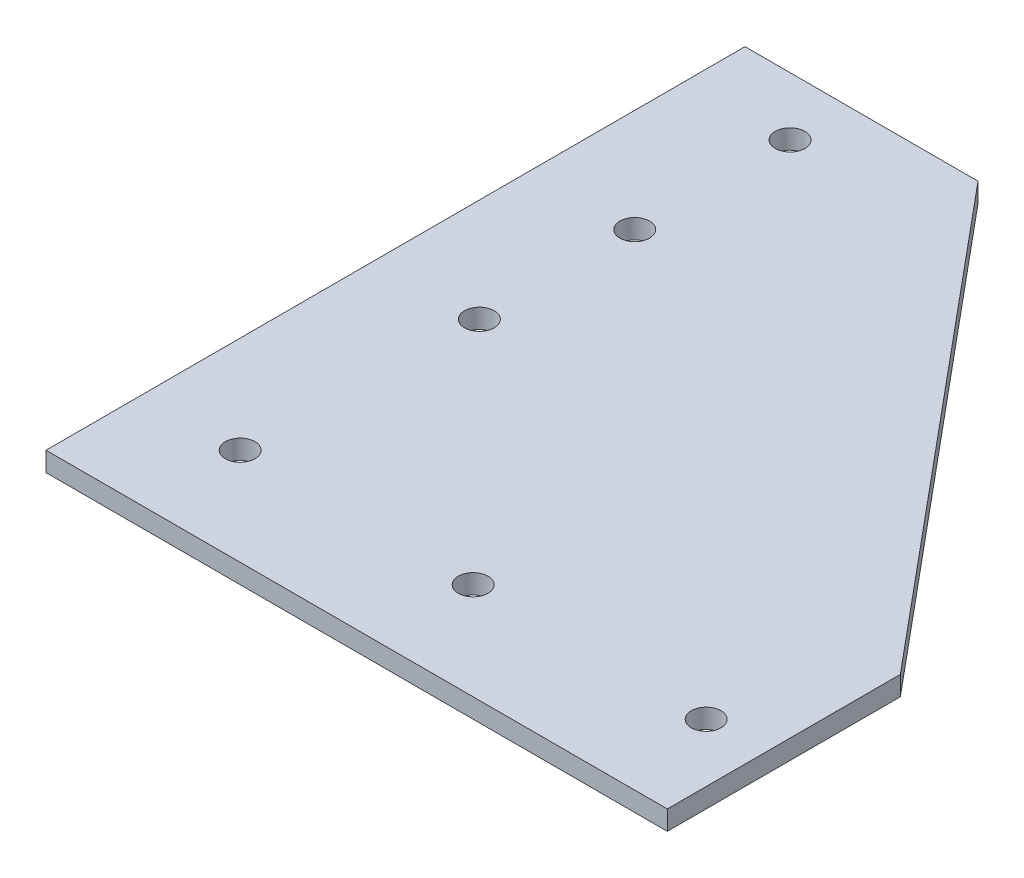
ISO-10303-21;
HEADER;
FILE_DESCRIPTION(('STEP AP214'),'2;1');
FILE_NAME('part.step','',(''),(''),'','','');
FILE_SCHEMA(('AUTOMOTIVE_DESIGN { 1 0 10303 214 1 1 1 1 }'));
ENDSEC;
DATA;
#1=APPLICATION_CONTEXT('core data for automotive mechanical design processes');
#2=APPLICATION_PROTOCOL_DEFINITION('international standard','automotive_design',2000,#1);
#3=PRODUCT_CONTEXT('',#1,'mechanical');
#4=PRODUCT('Part','Part','',(#3));
#5=PRODUCT_RELATED_PRODUCT_CATEGORY('part','',(#4));
#6=PRODUCT_DEFINITION_FORMATION('','',#4);
#7=PRODUCT_DEFINITION_CONTEXT('part definition',#1,'design');
#8=PRODUCT_DEFINITION('design','',#6,#7);
#9=PRODUCT_DEFINITION_SHAPE('','',#8);
#10=(LENGTH_UNIT() NAMED_UNIT(*) SI_UNIT(.MILLI.,.METRE.));
#11=(NAMED_UNIT(*) PLANE_ANGLE_UNIT() SI_UNIT($,.RADIAN.));
#12=(NAMED_UNIT(*) SI_UNIT($,.STERADIAN.) SOLID_ANGLE_UNIT());
#13=UNCERTAINTY_MEASURE_WITH_UNIT(LENGTH_MEASURE(1.E-05),#10,'distance_accuracy_value','');
#14=(GEOMETRIC_REPRESENTATION_CONTEXT(3) GLOBAL_UNCERTAINTY_ASSIGNED_CONTEXT((#13)) GLOBAL_UNIT_ASSIGNED_CONTEXT((#10,
#11,#12)) REPRESENTATION_CONTEXT('',''));
#15=CARTESIAN_POINT('',(0.,0.,0.));
#16=DIRECTION('',(0.,0.,1.));
#17=DIRECTION('',(1.,0.,0.));
#18=AXIS2_PLACEMENT_3D('',#15,#16,#17);
#19=CARTESIAN_POINT('',(0.,3.175,0.));
#20=DIRECTION('',(0.,-1.,0.));
#21=DIRECTION('',(0.,0.,-1.));
#22=AXIS2_PLACEMENT_3D('',#19,#20,#21);
#23=PLANE('',#22);
#24=DIRECTION('',(1.,0.,0.));
#25=VECTOR('',#24,1.);
#26=CARTESIAN_POINT('',(101.6,3.175,0.));
#27=LINE('',#26,#25);
#28=CARTESIAN_POINT('',(0.,3.175,0.));
#29=VERTEX_POINT('',#28);
#30=CARTESIAN_POINT('',(101.6,3.175,0.));
#31=VERTEX_POINT('',#30);
#32=EDGE_CURVE('E117',#29,#31,#27,.T.);
#33=ORIENTED_EDGE('',*,*,#32,.T.);
#34=DIRECTION('',(0.,0.,-1.));
#35=VECTOR('',#34,1.);
#36=CARTESIAN_POINT('',(101.6,3.175,-38.1));
#37=LINE('',#36,#35);
#38=CARTESIAN_POINT('',(101.6,3.175,-38.1));
#39=VERTEX_POINT('',#38);
#40=EDGE_CURVE('E84',#31,#39,#37,.T.);
#41=ORIENTED_EDGE('',*,*,#40,.T.);
#42=DIRECTION('',(-0.64018439966448,0.,-0.768221279597376));
#43=VECTOR('',#42,1.);
#44=CARTESIAN_POINT('',(38.1,3.175,-114.3));
#45=LINE('',#44,#43);
#46=CARTESIAN_POINT('',(38.1,3.175,-114.3));
#47=VERTEX_POINT('',#46);
#48=EDGE_CURVE('E88',#39,#47,#45,.T.);
#49=ORIENTED_EDGE('',*,*,#48,.T.);
#50=DIRECTION('',(-1.,0.,0.));
#51=VECTOR('',#50,1.);
#52=CARTESIAN_POINT('',(0.,3.175,-114.3));
#53=LINE('',#52,#51);
#54=CARTESIAN_POINT('',(0.,3.175,-114.3));
#55=VERTEX_POINT('',#54);
#56=EDGE_CURVE('E92',#47,#55,#53,.T.);
#57=ORIENTED_EDGE('',*,*,#56,.T.);
#58=DIRECTION('',(0.,0.,1.));
#59=VECTOR('',#58,1.);
#60=CARTESIAN_POINT('',(0.,3.175,0.));
#61=LINE('',#60,#59);
#62=EDGE_CURVE('E50',#55,#29,#61,.T.);
#63=ORIENTED_EDGE('',*,*,#62,.T.);
#64=EDGE_LOOP('',(#33,#41,#49,#57,#63));
#65=FACE_BOUND('',#64,.T.);
#66=CARTESIAN_POINT('',(15.875,3.175,-15.875));
#67=DIRECTION('',(0.,1.,0.));
#68=DIRECTION('',(0.,0.,1.));
#69=AXIS2_PLACEMENT_3D('',#66,#67,#68);
#70=CIRCLE('',#69,2.4257);
#71=CARTESIAN_POINT('',(15.875,3.175,-13.4493));
#72=VERTEX_POINT('',#71);
#73=EDGE_CURVE('E112',#72,#72,#70,.T.);
#74=ORIENTED_EDGE('',*,*,#73,.F.);
#75=EDGE_LOOP('',(#74));
#76=FACE_BOUND('',#75,.T.);
#77=CARTESIAN_POINT('',(53.975,3.175,-15.875));
#78=DIRECTION('',(0.,1.,0.));
#79=DIRECTION('',(0.,0.,1.));
#80=AXIS2_PLACEMENT_3D('',#77,#78,#79);
#81=CIRCLE('',#80,2.4257);
#82=CARTESIAN_POINT('',(53.975,3.175,-13.4493));
#83=VERTEX_POINT('',#82);
#84=EDGE_CURVE('E196',#83,#83,#81,.T.);
#85=ORIENTED_EDGE('',*,*,#84,.F.);
#86=EDGE_LOOP('',(#85));
#87=FACE_BOUND('',#86,.T.);
#88=CARTESIAN_POINT('',(92.075,3.175,-15.875));
#89=DIRECTION('',(0.,1.,0.));
#90=DIRECTION('',(0.,0.,1.));
#91=AXIS2_PLACEMENT_3D('',#88,#89,#90);
#92=CIRCLE('',#91,2.4257);
#93=CARTESIAN_POINT('',(92.075,3.175,-13.4493));
#94=VERTEX_POINT('',#93);
#95=EDGE_CURVE('E190',#94,#94,#92,.T.);
#96=ORIENTED_EDGE('',*,*,#95,.F.);
#97=EDGE_LOOP('',(#96));
#98=FACE_BOUND('',#97,.T.);
#99=CARTESIAN_POINT('',(16.891,3.175,-53.975));
#100=DIRECTION('',(0.,1.,0.));
#101=DIRECTION('',(0.,0.,1.));
#102=AXIS2_PLACEMENT_3D('',#99,#100,#101);
#103=CIRCLE('',#102,2.4257);
#104=CARTESIAN_POINT('',(16.891,3.175,-51.5493));
#105=VERTEX_POINT('',#104);
#106=EDGE_CURVE('E184',#105,#105,#103,.T.);
#107=ORIENTED_EDGE('',*,*,#106,.F.);
#108=EDGE_LOOP('',(#107));
#109=FACE_BOUND('',#108,.T.);
#110=CARTESIAN_POINT('',(16.8909999999999,3.175,-79.375));
#111=DIRECTION('',(0.,1.,0.));
#112=DIRECTION('',(0.,0.,1.));
#113=AXIS2_PLACEMENT_3D('',#110,#111,#112);
#114=CIRCLE('',#113,2.4257);
#115=CARTESIAN_POINT('',(16.8909999999999,3.175,-76.9493));
#116=VERTEX_POINT('',#115);
#117=EDGE_CURVE('E178',#116,#116,#114,.T.);
#118=ORIENTED_EDGE('',*,*,#117,.F.);
#119=EDGE_LOOP('',(#118));
#120=FACE_BOUND('',#119,.T.);
#121=CARTESIAN_POINT('',(16.8909999999998,3.175,-104.775));
#122=DIRECTION('',(0.,1.,0.));
#123=DIRECTION('',(0.,0.,1.));
#124=AXIS2_PLACEMENT_3D('',#121,#122,#123);
#125=CIRCLE('',#124,2.4257);
#126=CARTESIAN_POINT('',(16.8909999999998,3.175,-102.3493));
#127=VERTEX_POINT('',#126);
#128=EDGE_CURVE('E169',#127,#127,#125,.T.);
#129=ORIENTED_EDGE('',*,*,#128,.F.);
#130=EDGE_LOOP('',(#129));
#131=FACE_BOUND('',#130,.T.);
#132=ADVANCED_FACE('F33',(#65,#76,#87,#98,#109,#120,#131),#23,.F.);
#133=CARTESIAN_POINT('',(0.,0.,0.));
#134=DIRECTION('',(0.,-1.,0.));
#135=DIRECTION('',(0.,0.,-1.));
#136=AXIS2_PLACEMENT_3D('',#133,#134,#135);
#137=PLANE('',#136);
#138=CARTESIAN_POINT('',(16.8909999999999,0.,-79.375));
#139=DIRECTION('',(0.,1.,0.));
#140=DIRECTION('',(0.,0.,1.));
#141=AXIS2_PLACEMENT_3D('',#138,#139,#140);
#142=CIRCLE('',#141,2.4257);
#143=CARTESIAN_POINT('',(16.8909999999999,0.,-76.9493));
#144=VERTEX_POINT('',#143);
#145=EDGE_CURVE('E175',#144,#144,#142,.T.);
#146=ORIENTED_EDGE('',*,*,#145,.T.);
#147=EDGE_LOOP('',(#146));
#148=FACE_BOUND('',#147,.T.);
#149=CARTESIAN_POINT('',(92.075,0.,-15.875));
#150=DIRECTION('',(0.,1.,0.));
#151=DIRECTION('',(0.,0.,1.));
#152=AXIS2_PLACEMENT_3D('',#149,#150,#151);
#153=CIRCLE('',#152,2.4257);
#154=CARTESIAN_POINT('',(92.075,0.,-13.4493));
#155=VERTEX_POINT('',#154);
#156=EDGE_CURVE('E187',#155,#155,#153,.T.);
#157=ORIENTED_EDGE('',*,*,#156,.T.);
#158=EDGE_LOOP('',(#157));
#159=FACE_BOUND('',#158,.T.);
#160=CARTESIAN_POINT('',(15.875,0.,-15.875));
#161=DIRECTION('',(0.,1.,0.));
#162=DIRECTION('',(0.,0.,1.));
#163=AXIS2_PLACEMENT_3D('',#160,#161,#162);
#164=CIRCLE('',#163,2.4257);
#165=CARTESIAN_POINT('',(15.875,0.,-13.4493));
#166=VERTEX_POINT('',#165);
#167=EDGE_CURVE('E199',#166,#166,#164,.T.);
#168=ORIENTED_EDGE('',*,*,#167,.T.);
#169=EDGE_LOOP('',(#168));
#170=FACE_BOUND('',#169,.T.);
#171=DIRECTION('',(1.,0.,0.));
#172=VECTOR('',#171,1.);
#173=CARTESIAN_POINT('',(101.6,0.,0.));
#174=LINE('',#173,#172);
#175=CARTESIAN_POINT('',(0.,0.,0.));
#176=VERTEX_POINT('',#175);
#177=CARTESIAN_POINT('',(101.6,0.,0.));
#178=VERTEX_POINT('',#177);
#179=EDGE_CURVE('E108',#176,#178,#174,.T.);
#180=ORIENTED_EDGE('',*,*,#179,.F.);
#181=DIRECTION('',(0.,0.,1.));
#182=VECTOR('',#181,1.);
#183=CARTESIAN_POINT('',(0.,0.,0.));
#184=LINE('',#183,#182);
#185=CARTESIAN_POINT('',(0.,0.,-114.3));
#186=VERTEX_POINT('',#185);
#187=EDGE_CURVE('E76',#186,#176,#184,.T.);
#188=ORIENTED_EDGE('',*,*,#187,.F.);
#189=DIRECTION('',(-1.,0.,0.));
#190=VECTOR('',#189,1.);
#191=CARTESIAN_POINT('',(0.,0.,-114.3));
#192=LINE('',#191,#190);
#193=CARTESIAN_POINT('',(38.1,0.,-114.3));
#194=VERTEX_POINT('',#193);
#195=EDGE_CURVE('E70',#194,#186,#192,.T.);
#196=ORIENTED_EDGE('',*,*,#195,.F.);
#197=DIRECTION('',(-0.64018439966448,0.,-0.768221279597376));
#198=VECTOR('',#197,1.);
#199=CARTESIAN_POINT('',(38.1,0.,-114.3));
#200=LINE('',#199,#198);
#201=CARTESIAN_POINT('',(101.6,0.,-38.1));
#202=VERTEX_POINT('',#201);
#203=EDGE_CURVE('E99',#202,#194,#200,.T.);
#204=ORIENTED_EDGE('',*,*,#203,.F.);
#205=DIRECTION('',(0.,0.,-1.));
#206=VECTOR('',#205,1.);
#207=CARTESIAN_POINT('',(101.6,0.,-38.1));
#208=LINE('',#207,#206);
#209=EDGE_CURVE('E111',#178,#202,#208,.T.);
#210=ORIENTED_EDGE('',*,*,#209,.F.);
#211=EDGE_LOOP('',(#180,#188,#196,#204,#210));
#212=FACE_BOUND('',#211,.T.);
#213=CARTESIAN_POINT('',(53.975,0.,-15.875));
#214=DIRECTION('',(0.,1.,0.));
#215=DIRECTION('',(0.,0.,1.));
#216=AXIS2_PLACEMENT_3D('',#213,#214,#215);
#217=CIRCLE('',#216,2.4257);
#218=CARTESIAN_POINT('',(53.975,0.,-13.4493));
#219=VERTEX_POINT('',#218);
#220=EDGE_CURVE('E193',#219,#219,#217,.T.);
#221=ORIENTED_EDGE('',*,*,#220,.T.);
#222=EDGE_LOOP('',(#221));
#223=FACE_BOUND('',#222,.T.);
#224=CARTESIAN_POINT('',(16.891,0.,-53.975));
#225=DIRECTION('',(0.,1.,0.));
#226=DIRECTION('',(0.,0.,1.));
#227=AXIS2_PLACEMENT_3D('',#224,#225,#226);
#228=CIRCLE('',#227,2.4257);
#229=CARTESIAN_POINT('',(16.891,0.,-51.5493));
#230=VERTEX_POINT('',#229);
#231=EDGE_CURVE('E181',#230,#230,#228,.T.);
#232=ORIENTED_EDGE('',*,*,#231,.T.);
#233=EDGE_LOOP('',(#232));
#234=FACE_BOUND('',#233,.T.);
#235=CARTESIAN_POINT('',(16.8909999999998,0.,-104.775));
#236=DIRECTION('',(0.,1.,0.));
#237=DIRECTION('',(0.,0.,1.));
#238=AXIS2_PLACEMENT_3D('',#235,#236,#237);
#239=CIRCLE('',#238,2.4257);
#240=CARTESIAN_POINT('',(16.8909999999998,0.,-102.3493));
#241=VERTEX_POINT('',#240);
#242=EDGE_CURVE('E172',#241,#241,#239,.T.);
#243=ORIENTED_EDGE('',*,*,#242,.T.);
#244=EDGE_LOOP('',(#243));
#245=FACE_BOUND('',#244,.T.);
#246=ADVANCED_FACE('F121',(#148,#159,#170,#212,#223,#234,#245),#137,.T.);
#247=CARTESIAN_POINT('',(101.6,3.175,0.));
#248=DIRECTION('',(0.,0.,-1.));
#249=DIRECTION('',(-1.,0.,0.));
#250=AXIS2_PLACEMENT_3D('',#247,#248,#249);
#251=PLANE('',#250);
#252=ORIENTED_EDGE('',*,*,#179,.T.);
#253=DIRECTION('',(0.,-1.,0.));
#254=VECTOR('',#253,1.);
#255=CARTESIAN_POINT('',(101.6,3.175,0.));
#256=LINE('',#255,#254);
#257=EDGE_CURVE('E11',#31,#178,#256,.T.);
#258=ORIENTED_EDGE('',*,*,#257,.F.);
#259=ORIENTED_EDGE('',*,*,#32,.F.);
#260=DIRECTION('',(0.,-1.,0.));
#261=VECTOR('',#260,1.);
#262=CARTESIAN_POINT('',(0.,3.175,0.));
#263=LINE('',#262,#261);
#264=EDGE_CURVE('E104',#29,#176,#263,.T.);
#265=ORIENTED_EDGE('',*,*,#264,.T.);
#266=EDGE_LOOP('',(#252,#258,#259,#265));
#267=FACE_BOUND('',#266,.T.);
#268=ADVANCED_FACE('F35',(#267),#251,.F.);
#269=CARTESIAN_POINT('',(101.6,3.175,-38.1));
#270=DIRECTION('',(-1.,0.,0.));
#271=DIRECTION('',(0.,0.,1.));
#272=AXIS2_PLACEMENT_3D('',#269,#270,#271);
#273=PLANE('',#272);
#274=ORIENTED_EDGE('',*,*,#209,.T.);
#275=DIRECTION('',(0.,-1.,0.));
#276=VECTOR('',#275,1.);
#277=CARTESIAN_POINT('',(101.6,3.175,-38.1));
#278=LINE('',#277,#276);
#279=EDGE_CURVE('E42',#39,#202,#278,.T.);
#280=ORIENTED_EDGE('',*,*,#279,.F.);
#281=ORIENTED_EDGE('',*,*,#40,.F.);
#282=ORIENTED_EDGE('',*,*,#257,.T.);
#283=EDGE_LOOP('',(#274,#280,#281,#282));
#284=FACE_BOUND('',#283,.T.);
#285=ADVANCED_FACE('F268',(#284),#273,.F.);
#286=CARTESIAN_POINT('',(38.1,3.175,-114.3));
#287=DIRECTION('',(-0.768221279597376,0.,0.64018439966448));
#288=DIRECTION('',(0.64018439966448,0.,0.768221279597376));
#289=AXIS2_PLACEMENT_3D('',#286,#287,#288);
#290=PLANE('',#289);
#291=ORIENTED_EDGE('',*,*,#203,.T.);
#292=DIRECTION('',(0.,-1.,0.));
#293=VECTOR('',#292,1.);
#294=CARTESIAN_POINT('',(38.1,3.175,-114.3));
#295=LINE('',#294,#293);
#296=EDGE_CURVE('E96',#47,#194,#295,.T.);
#297=ORIENTED_EDGE('',*,*,#296,.F.);
#298=ORIENTED_EDGE('',*,*,#48,.F.);
#299=ORIENTED_EDGE('',*,*,#279,.T.);
#300=EDGE_LOOP('',(#291,#297,#298,#299));
#301=FACE_BOUND('',#300,.T.);
#302=ADVANCED_FACE('F97',(#301),#290,.F.);
#303=CARTESIAN_POINT('',(0.,3.175,-114.3));
#304=DIRECTION('',(0.,0.,1.));
#305=DIRECTION('',(1.,0.,0.));
#306=AXIS2_PLACEMENT_3D('',#303,#304,#305);
#307=PLANE('',#306);
#308=ORIENTED_EDGE('',*,*,#195,.T.);
#309=DIRECTION('',(0.,-1.,0.));
#310=VECTOR('',#309,1.);
#311=CARTESIAN_POINT('',(0.,3.175,-114.3));
#312=LINE('',#311,#310);
#313=EDGE_CURVE('E100',#55,#186,#312,.T.);
#314=ORIENTED_EDGE('',*,*,#313,.F.);
#315=ORIENTED_EDGE('',*,*,#56,.F.);
#316=ORIENTED_EDGE('',*,*,#296,.T.);
#317=EDGE_LOOP('',(#308,#314,#315,#316));
#318=FACE_BOUND('',#317,.T.);
#319=ADVANCED_FACE('F102',(#318),#307,.F.);
#320=CARTESIAN_POINT('',(0.,3.175,0.));
#321=DIRECTION('',(1.,0.,0.));
#322=DIRECTION('',(0.,0.,-1.));
#323=AXIS2_PLACEMENT_3D('',#320,#321,#322);
#324=PLANE('',#323);
#325=ORIENTED_EDGE('',*,*,#187,.T.);
#326=ORIENTED_EDGE('',*,*,#264,.F.);
#327=ORIENTED_EDGE('',*,*,#62,.F.);
#328=ORIENTED_EDGE('',*,*,#313,.T.);
#329=EDGE_LOOP('',(#325,#326,#327,#328));
#330=FACE_BOUND('',#329,.T.);
#331=ADVANCED_FACE('F126',(#330),#324,.F.);
#332=CARTESIAN_POINT('',(15.875,3.175,-15.875));
#333=DIRECTION('',(0.,-1.,0.));
#334=DIRECTION('',(0.,0.,-1.));
#335=AXIS2_PLACEMENT_3D('',#332,#333,#334);
#336=CYLINDRICAL_SURFACE('',#335,2.4257);
#337=ORIENTED_EDGE('',*,*,#73,.T.);
#338=EDGE_LOOP('',(#337));
#339=FACE_BOUND('',#338,.T.);
#340=ORIENTED_EDGE('',*,*,#167,.F.);
#341=EDGE_LOOP('',(#340));
#342=FACE_BOUND('',#341,.T.);
#343=ADVANCED_FACE('F128',(#339,#342),#336,.F.);
#344=CARTESIAN_POINT('',(53.975,3.175,-15.875));
#345=DIRECTION('',(0.,-1.,0.));
#346=DIRECTION('',(0.,0.,-1.));
#347=AXIS2_PLACEMENT_3D('',#344,#345,#346);
#348=CYLINDRICAL_SURFACE('',#347,2.4257);
#349=ORIENTED_EDGE('',*,*,#84,.T.);
#350=EDGE_LOOP('',(#349));
#351=FACE_BOUND('',#350,.T.);
#352=ORIENTED_EDGE('',*,*,#220,.F.);
#353=EDGE_LOOP('',(#352));
#354=FACE_BOUND('',#353,.T.);
#355=ADVANCED_FACE('F134',(#351,#354),#348,.F.);
#356=CARTESIAN_POINT('',(92.075,3.175,-15.875));
#357=DIRECTION('',(0.,-1.,0.));
#358=DIRECTION('',(0.,0.,-1.));
#359=AXIS2_PLACEMENT_3D('',#356,#357,#358);
#360=CYLINDRICAL_SURFACE('',#359,2.4257);
#361=ORIENTED_EDGE('',*,*,#95,.T.);
#362=EDGE_LOOP('',(#361));
#363=FACE_BOUND('',#362,.T.);
#364=ORIENTED_EDGE('',*,*,#156,.F.);
#365=EDGE_LOOP('',(#364));
#366=FACE_BOUND('',#365,.T.);
#367=ADVANCED_FACE('F148',(#363,#366),#360,.F.);
#368=CARTESIAN_POINT('',(16.891,3.175,-53.975));
#369=DIRECTION('',(0.,-1.,0.));
#370=DIRECTION('',(0.,0.,-1.));
#371=AXIS2_PLACEMENT_3D('',#368,#369,#370);
#372=CYLINDRICAL_SURFACE('',#371,2.4257);
#373=ORIENTED_EDGE('',*,*,#106,.T.);
#374=EDGE_LOOP('',(#373));
#375=FACE_BOUND('',#374,.T.);
#376=ORIENTED_EDGE('',*,*,#231,.F.);
#377=EDGE_LOOP('',(#376));
#378=FACE_BOUND('',#377,.T.);
#379=ADVANCED_FACE('F152',(#375,#378),#372,.F.);
#380=CARTESIAN_POINT('',(16.8909999999999,3.175,-79.375));
#381=DIRECTION('',(0.,-1.,0.));
#382=DIRECTION('',(0.,0.,-1.));
#383=AXIS2_PLACEMENT_3D('',#380,#381,#382);
#384=CYLINDRICAL_SURFACE('',#383,2.4257);
#385=ORIENTED_EDGE('',*,*,#117,.T.);
#386=EDGE_LOOP('',(#385));
#387=FACE_BOUND('',#386,.T.);
#388=ORIENTED_EDGE('',*,*,#145,.F.);
#389=EDGE_LOOP('',(#388));
#390=FACE_BOUND('',#389,.T.);
#391=ADVANCED_FACE('F156',(#387,#390),#384,.F.);
#392=CARTESIAN_POINT('',(16.8909999999998,3.175,-104.775));
#393=DIRECTION('',(0.,-1.,0.));
#394=DIRECTION('',(0.,0.,-1.));
#395=AXIS2_PLACEMENT_3D('',#392,#393,#394);
#396=CYLINDRICAL_SURFACE('',#395,2.4257);
#397=ORIENTED_EDGE('',*,*,#128,.T.);
#398=EDGE_LOOP('',(#397));
#399=FACE_BOUND('',#398,.T.);
#400=ORIENTED_EDGE('',*,*,#242,.F.);
#401=EDGE_LOOP('',(#400));
#402=FACE_BOUND('',#401,.T.);
#403=ADVANCED_FACE('F160',(#399,#402),#396,.F.);
#404=CLOSED_SHELL('',(#132,#246,#268,#285,#302,#319,#331,#343,#355,#367,#379,#391,#403));
#405=MANIFOLD_SOLID_BREP('B2',#404);
#406=ADVANCED_BREP_SHAPE_REPRESENTATION('',(#18,#405),#14);
#407=SHAPE_DEFINITION_REPRESENTATION(#9,#406);
ENDSEC;
END-ISO-10303-21;
